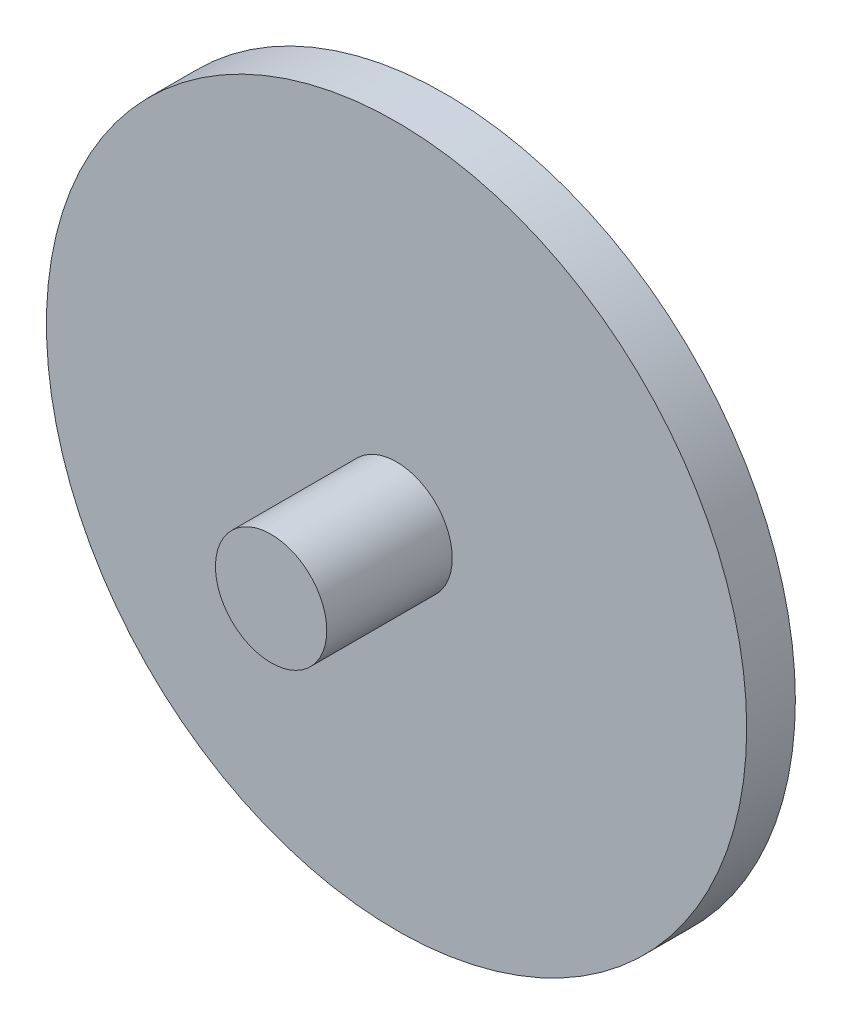
ISO-10303-21;
HEADER;
FILE_DESCRIPTION(('STEP AP214'),'2;1');
FILE_NAME('part.step','',(''),(''),'','','');
FILE_SCHEMA(('AUTOMOTIVE_DESIGN { 1 0 10303 214 1 1 1 1 }'));
ENDSEC;
DATA;
#1=APPLICATION_CONTEXT('core data for automotive mechanical design processes');
#2=APPLICATION_PROTOCOL_DEFINITION('international standard','automotive_design',2000,#1);
#3=PRODUCT_CONTEXT('',#1,'mechanical');
#4=PRODUCT('Part','Part','',(#3));
#5=PRODUCT_RELATED_PRODUCT_CATEGORY('part','',(#4));
#6=PRODUCT_DEFINITION_FORMATION('','',#4);
#7=PRODUCT_DEFINITION_CONTEXT('part definition',#1,'design');
#8=PRODUCT_DEFINITION('design','',#6,#7);
#9=PRODUCT_DEFINITION_SHAPE('','',#8);
#10=(LENGTH_UNIT() NAMED_UNIT(*) SI_UNIT(.MILLI.,.METRE.));
#11=(NAMED_UNIT(*) PLANE_ANGLE_UNIT() SI_UNIT($,.RADIAN.));
#12=(NAMED_UNIT(*) SI_UNIT($,.STERADIAN.) SOLID_ANGLE_UNIT());
#13=UNCERTAINTY_MEASURE_WITH_UNIT(LENGTH_MEASURE(1.E-05),#10,'distance_accuracy_value','');
#14=(GEOMETRIC_REPRESENTATION_CONTEXT(3) GLOBAL_UNCERTAINTY_ASSIGNED_CONTEXT((#13)) GLOBAL_UNIT_ASSIGNED_CONTEXT((#10,
#11,#12)) REPRESENTATION_CONTEXT('',''));
#15=CARTESIAN_POINT('',(0.,0.,0.));
#16=DIRECTION('',(0.,0.,1.));
#17=DIRECTION('',(1.,0.,0.));
#18=AXIS2_PLACEMENT_3D('',#15,#16,#17);
#19=CARTESIAN_POINT('',(0.,0.,13.208));
#20=DIRECTION('',(0.,0.,-1.));
#21=DIRECTION('',(-1.,0.,0.));
#22=AXIS2_PLACEMENT_3D('',#19,#20,#21);
#23=CYLINDRICAL_SURFACE('',#22,95.);
#24=CARTESIAN_POINT('',(0.,0.,13.208));
#25=DIRECTION('',(0.,0.,1.));
#26=DIRECTION('',(1.,0.,0.));
#27=AXIS2_PLACEMENT_3D('',#24,#25,#26);
#28=CIRCLE('',#27,95.);
#29=CARTESIAN_POINT('',(95.,0.,13.208));
#30=VERTEX_POINT('',#29);
#31=EDGE_CURVE('E10',#30,#30,#28,.T.);
#32=ORIENTED_EDGE('',*,*,#31,.F.);
#33=EDGE_LOOP('',(#32));
#34=FACE_BOUND('',#33,.T.);
#35=CARTESIAN_POINT('',(0.,0.,0.));
#36=DIRECTION('',(0.,0.,1.));
#37=DIRECTION('',(1.,0.,0.));
#38=AXIS2_PLACEMENT_3D('',#35,#36,#37);
#39=CIRCLE('',#38,95.);
#40=CARTESIAN_POINT('',(95.,0.,0.));
#41=VERTEX_POINT('',#40);
#42=EDGE_CURVE('E35',#41,#41,#39,.T.);
#43=ORIENTED_EDGE('',*,*,#42,.T.);
#44=EDGE_LOOP('',(#43));
#45=FACE_BOUND('',#44,.T.);
#46=ADVANCED_FACE('F32',(#34,#45),#23,.T.);
#47=CARTESIAN_POINT('',(0.,0.,13.208));
#48=DIRECTION('',(0.,0.,1.));
#49=DIRECTION('',(1.,0.,0.));
#50=AXIS2_PLACEMENT_3D('',#47,#48,#49);
#51=PLANE('',#50);
#52=CARTESIAN_POINT('',(0.,0.,13.208));
#53=DIRECTION('',(0.,0.,1.));
#54=DIRECTION('',(1.,0.,0.));
#55=AXIS2_PLACEMENT_3D('',#52,#53,#54);
#56=CIRCLE('',#55,15.1013678996771);
#57=CARTESIAN_POINT('',(15.1013678996771,0.,13.208));
#58=VERTEX_POINT('',#57);
#59=EDGE_CURVE('E57',#58,#58,#56,.T.);
#60=ORIENTED_EDGE('',*,*,#59,.F.);
#61=EDGE_LOOP('',(#60));
#62=FACE_BOUND('',#61,.T.);
#63=ORIENTED_EDGE('',*,*,#31,.T.);
#64=EDGE_LOOP('',(#63));
#65=FACE_BOUND('',#64,.T.);
#66=ADVANCED_FACE('F72',(#62,#65),#51,.T.);
#67=CARTESIAN_POINT('',(0.,0.,0.));
#68=DIRECTION('',(0.,0.,1.));
#69=DIRECTION('',(1.,0.,0.));
#70=AXIS2_PLACEMENT_3D('',#67,#68,#69);
#71=PLANE('',#70);
#72=ORIENTED_EDGE('',*,*,#42,.F.);
#73=EDGE_LOOP('',(#72));
#74=FACE_BOUND('',#73,.T.);
#75=ADVANCED_FACE('F68',(#74),#71,.F.);
#76=CARTESIAN_POINT('',(0.,0.,47.244));
#77=DIRECTION('',(0.,0.,-1.));
#78=DIRECTION('',(-1.,0.,0.));
#79=AXIS2_PLACEMENT_3D('',#76,#77,#78);
#80=CYLINDRICAL_SURFACE('',#79,15.1013678996771);
#81=CARTESIAN_POINT('',(0.,0.,47.244));
#82=DIRECTION('',(0.,0.,1.));
#83=DIRECTION('',(1.,0.,0.));
#84=AXIS2_PLACEMENT_3D('',#81,#82,#83);
#85=CIRCLE('',#84,15.1013678996771);
#86=CARTESIAN_POINT('',(15.1013678996771,0.,47.244));
#87=VERTEX_POINT('',#86);
#88=EDGE_CURVE('E56',#87,#87,#85,.T.);
#89=ORIENTED_EDGE('',*,*,#88,.F.);
#90=EDGE_LOOP('',(#89));
#91=FACE_BOUND('',#90,.T.);
#92=ORIENTED_EDGE('',*,*,#59,.T.);
#93=EDGE_LOOP('',(#92));
#94=FACE_BOUND('',#93,.T.);
#95=ADVANCED_FACE('F65',(#91,#94),#80,.T.);
#96=CARTESIAN_POINT('',(0.,0.,47.244));
#97=DIRECTION('',(0.,0.,1.));
#98=DIRECTION('',(1.,0.,0.));
#99=AXIS2_PLACEMENT_3D('',#96,#97,#98);
#100=PLANE('',#99);
#101=ORIENTED_EDGE('',*,*,#88,.T.);
#102=EDGE_LOOP('',(#101));
#103=FACE_BOUND('',#102,.T.);
#104=ADVANCED_FACE('F63',(#103),#100,.T.);
#105=CLOSED_SHELL('',(#46,#66,#75,#95,#104));
#106=CARTESIAN_POINT('',(0.,0.,9.906));
#107=DIRECTION('',(0.,0.,1.));
#108=DIRECTION('',(1.,0.,0.));
#109=AXIS2_PLACEMENT_3D('',#106,#107,#108);
#110=CYLINDRICAL_SURFACE('',#109,6.28063265677661);
#111=CARTESIAN_POINT('',(0.,0.,9.906));
#112=DIRECTION('',(0.,0.,1.));
#113=DIRECTION('',(1.,0.,0.));
#114=AXIS2_PLACEMENT_3D('',#111,#112,#113);
#115=CIRCLE('',#114,6.28063265677661);
#116=CARTESIAN_POINT('',(6.28063265677661,0.,9.906));
#117=VERTEX_POINT('',#116);
#118=EDGE_CURVE('E47',#117,#117,#115,.T.);
#119=ORIENTED_EDGE('',*,*,#118,.T.);
#120=EDGE_LOOP('',(#119));
#121=FACE_BOUND('',#120,.T.);
#122=CARTESIAN_POINT('',(0.,0.,13.208));
#123=DIRECTION('',(0.,0.,1.));
#124=DIRECTION('',(1.,0.,0.));
#125=AXIS2_PLACEMENT_3D('',#122,#123,#124);
#126=CIRCLE('',#125,6.28063265677661);
#127=CARTESIAN_POINT('',(6.28063265677661,0.,13.208));
#128=VERTEX_POINT('',#127);
#129=EDGE_CURVE('E48',#128,#128,#126,.T.);
#130=ORIENTED_EDGE('',*,*,#129,.F.);
#131=EDGE_LOOP('',(#130));
#132=FACE_BOUND('',#131,.T.);
#133=ADVANCED_FACE('F93',(#121,#132),#110,.T.);
#134=CARTESIAN_POINT('',(0.,0.,9.906));
#135=DIRECTION('',(0.,0.,1.));
#136=DIRECTION('',(1.,0.,0.));
#137=AXIS2_PLACEMENT_3D('',#134,#135,#136);
#138=PLANE('',#137);
#139=ORIENTED_EDGE('',*,*,#118,.F.);
#140=EDGE_LOOP('',(#139));
#141=FACE_BOUND('',#140,.T.);
#142=CARTESIAN_POINT('',(0.,0.,9.906));
#143=DIRECTION('',(0.,0.,1.));
#144=DIRECTION('',(1.,0.,0.));
#145=AXIS2_PLACEMENT_3D('',#142,#143,#144);
#146=CIRCLE('',#145,8.82063265677661);
#147=CARTESIAN_POINT('',(8.82063265677661,0.,9.906));
#148=VERTEX_POINT('',#147);
#149=EDGE_CURVE('E43',#148,#148,#146,.T.);
#150=ORIENTED_EDGE('',*,*,#149,.T.);
#151=EDGE_LOOP('',(#150));
#152=FACE_BOUND('',#151,.T.);
#153=ADVANCED_FACE('F88',(#141,#152),#138,.T.);
#154=CARTESIAN_POINT('',(0.,0.,9.906));
#155=DIRECTION('',(0.,0.,1.));
#156=DIRECTION('',(1.,0.,0.));
#157=AXIS2_PLACEMENT_3D('',#154,#155,#156);
#158=CYLINDRICAL_SURFACE('',#157,8.82063265677661);
#159=ORIENTED_EDGE('',*,*,#149,.F.);
#160=EDGE_LOOP('',(#159));
#161=FACE_BOUND('',#160,.T.);
#162=CARTESIAN_POINT('',(0.,0.,13.208));
#163=DIRECTION('',(0.,0.,1.));
#164=DIRECTION('',(1.,0.,0.));
#165=AXIS2_PLACEMENT_3D('',#162,#163,#164);
#166=CIRCLE('',#165,8.82063265677661);
#167=CARTESIAN_POINT('',(8.82063265677661,0.,13.208));
#168=VERTEX_POINT('',#167);
#169=EDGE_CURVE('E51',#168,#168,#166,.F.);
#170=ORIENTED_EDGE('',*,*,#169,.F.);
#171=EDGE_LOOP('',(#170));
#172=FACE_BOUND('',#171,.T.);
#173=ADVANCED_FACE('F84',(#161,#172),#158,.F.);
#174=CARTESIAN_POINT('',(0.,0.,13.208));
#175=DIRECTION('',(0.,0.,1.));
#176=DIRECTION('',(1.,0.,0.));
#177=AXIS2_PLACEMENT_3D('',#174,#175,#176);
#178=PLANE('',#177);
#179=ORIENTED_EDGE('',*,*,#169,.T.);
#180=EDGE_LOOP('',(#179));
#181=FACE_BOUND('',#180,.T.);
#182=ORIENTED_EDGE('',*,*,#129,.T.);
#183=EDGE_LOOP('',(#182));
#184=FACE_BOUND('',#183,.T.);
#185=ADVANCED_FACE('F87',(#181,#184),#178,.F.);
#186=CLOSED_SHELL('',(#133,#153,#173,#185));
#187=ORIENTED_CLOSED_SHELL('',*,#186,.T.);
#188=BREP_WITH_VOIDS('B2',#105,(#187));
#189=ADVANCED_BREP_SHAPE_REPRESENTATION('',(#18,#188),#14);
#190=SHAPE_DEFINITION_REPRESENTATION(#9,#189);
ENDSEC;
END-ISO-10303-21;
